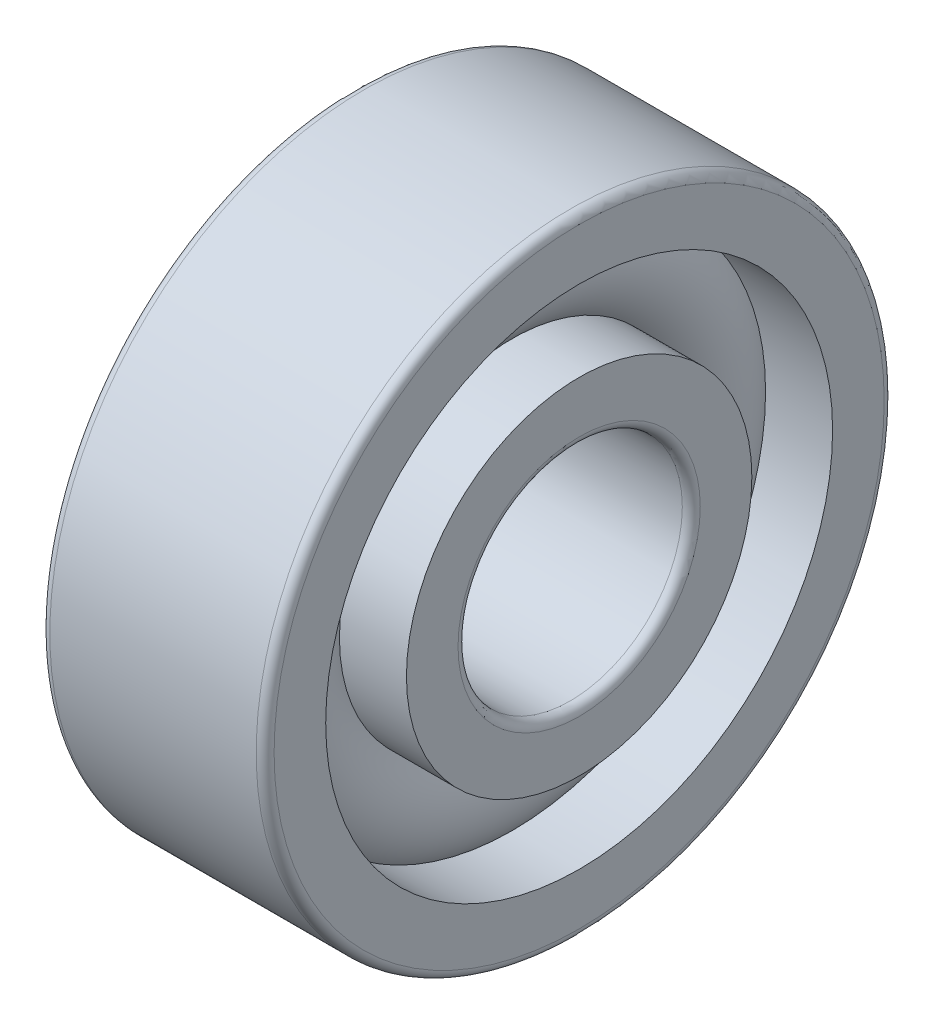
ISO-10303-21;
HEADER;
FILE_DESCRIPTION(('STEP AP214'),'2;1');
FILE_NAME('part.step','',(''),(''),'','','');
FILE_SCHEMA(('AUTOMOTIVE_DESIGN { 1 0 10303 214 1 1 1 1 }'));
ENDSEC;
DATA;
#1=APPLICATION_CONTEXT('core data for automotive mechanical design processes');
#2=APPLICATION_PROTOCOL_DEFINITION('international standard','automotive_design',2000,#1);
#3=PRODUCT_CONTEXT('',#1,'mechanical');
#4=PRODUCT('Part','Part','',(#3));
#5=PRODUCT_RELATED_PRODUCT_CATEGORY('part','',(#4));
#6=PRODUCT_DEFINITION_FORMATION('','',#4);
#7=PRODUCT_DEFINITION_CONTEXT('part definition',#1,'design');
#8=PRODUCT_DEFINITION('design','',#6,#7);
#9=PRODUCT_DEFINITION_SHAPE('','',#8);
#10=(LENGTH_UNIT() NAMED_UNIT(*) SI_UNIT(.MILLI.,.METRE.));
#11=(NAMED_UNIT(*) PLANE_ANGLE_UNIT() SI_UNIT($,.RADIAN.));
#12=(NAMED_UNIT(*) SI_UNIT($,.STERADIAN.) SOLID_ANGLE_UNIT());
#13=UNCERTAINTY_MEASURE_WITH_UNIT(LENGTH_MEASURE(1.E-05),#10,'distance_accuracy_value','');
#14=(GEOMETRIC_REPRESENTATION_CONTEXT(3) GLOBAL_UNCERTAINTY_ASSIGNED_CONTEXT((#13)) GLOBAL_UNIT_ASSIGNED_CONTEXT((#10,
#11,#12)) REPRESENTATION_CONTEXT('',''));
#15=CARTESIAN_POINT('',(0.,0.,0.));
#16=DIRECTION('',(0.,0.,1.));
#17=DIRECTION('',(1.,0.,0.));
#18=AXIS2_PLACEMENT_3D('',#15,#16,#17);
#19=CARTESIAN_POINT('',(0.,0.,0.));
#20=DIRECTION('',(-1.,0.,0.));
#21=DIRECTION('',(0.,0.,1.));
#22=AXIS2_PLACEMENT_3D('',#19,#20,#21);
#23=TOROIDAL_SURFACE('',#22,4.75,1.35);
#24=CARTESIAN_POINT('',(1.0062305898749,0.,0.));
#25=DIRECTION('',(-1.,0.,0.));
#26=DIRECTION('',(0.,0.,1.));
#27=AXIS2_PLACEMENT_3D('',#24,#25,#26);
#28=CIRCLE('',#27,5.65000000000001);
#29=CARTESIAN_POINT('',(1.0062305898749,0.,5.65000000000001));
#30=VERTEX_POINT('',#29);
#31=EDGE_CURVE('E38',#30,#30,#28,.F.);
#32=ORIENTED_EDGE('',*,*,#31,.T.);
#33=EDGE_LOOP('',(#32));
#34=FACE_BOUND('',#33,.T.);
#35=CARTESIAN_POINT('',(1.00623058987491,0.,0.));
#36=DIRECTION('',(-1.,0.,0.));
#37=DIRECTION('',(0.,0.,1.));
#38=AXIS2_PLACEMENT_3D('',#35,#36,#37);
#39=CIRCLE('',#38,3.85);
#40=CARTESIAN_POINT('',(1.00623058987491,0.,3.85));
#41=VERTEX_POINT('',#40);
#42=EDGE_CURVE('E10',#41,#41,#39,.T.);
#43=ORIENTED_EDGE('',*,*,#42,.T.);
#44=EDGE_LOOP('',(#43));
#45=FACE_BOUND('',#44,.T.);
#46=ADVANCED_FACE('F34',(#34,#45),#23,.T.);
#47=CARTESIAN_POINT('',(-20.6375,0.,0.));
#48=DIRECTION('',(1.,0.,0.));
#49=DIRECTION('',(0.,0.,-1.));
#50=AXIS2_PLACEMENT_3D('',#47,#48,#49);
#51=CYLINDRICAL_SURFACE('',#50,3.85);
#52=CARTESIAN_POINT('',(2.5,0.,0.));
#53=DIRECTION('',(1.,0.,0.));
#54=DIRECTION('',(0.,0.,-1.));
#55=AXIS2_PLACEMENT_3D('',#52,#53,#54);
#56=CIRCLE('',#55,3.85);
#57=CARTESIAN_POINT('',(2.5,0.,-3.85));
#58=VERTEX_POINT('',#57);
#59=EDGE_CURVE('E47',#58,#58,#56,.T.);
#60=ORIENTED_EDGE('',*,*,#59,.F.);
#61=EDGE_LOOP('',(#60));
#62=FACE_BOUND('',#61,.T.);
#63=ORIENTED_EDGE('',*,*,#42,.F.);
#64=EDGE_LOOP('',(#63));
#65=FACE_BOUND('',#64,.T.);
#66=ADVANCED_FACE('F86',(#62,#65),#51,.T.);
#67=CARTESIAN_POINT('',(-20.6375,0.,0.));
#68=DIRECTION('',(1.,0.,0.));
#69=DIRECTION('',(0.,0.,-1.));
#70=AXIS2_PLACEMENT_3D('',#67,#68,#69);
#71=CYLINDRICAL_SURFACE('',#70,3.85);
#72=CARTESIAN_POINT('',(-2.5,0.,0.));
#73=DIRECTION('',(1.,0.,0.));
#74=DIRECTION('',(0.,0.,-1.));
#75=AXIS2_PLACEMENT_3D('',#72,#73,#74);
#76=CIRCLE('',#75,3.85);
#77=CARTESIAN_POINT('',(-2.5,0.,-3.85));
#78=VERTEX_POINT('',#77);
#79=EDGE_CURVE('E56',#78,#78,#76,.T.);
#80=ORIENTED_EDGE('',*,*,#79,.T.);
#81=EDGE_LOOP('',(#80));
#82=FACE_BOUND('',#81,.T.);
#83=CARTESIAN_POINT('',(-1.00623058987491,0.,0.));
#84=DIRECTION('',(1.,0.,0.));
#85=DIRECTION('',(0.,0.,-1.));
#86=AXIS2_PLACEMENT_3D('',#83,#84,#85);
#87=CIRCLE('',#86,3.85);
#88=CARTESIAN_POINT('',(-1.00623058987491,0.,-3.85));
#89=VERTEX_POINT('',#88);
#90=EDGE_CURVE('E42',#89,#89,#87,.T.);
#91=ORIENTED_EDGE('',*,*,#90,.F.);
#92=EDGE_LOOP('',(#91));
#93=FACE_BOUND('',#92,.T.);
#94=ADVANCED_FACE('F89',(#82,#93),#71,.T.);
#95=CARTESIAN_POINT('',(2.5,2.7,0.));
#96=DIRECTION('',(1.,0.,0.));
#97=DIRECTION('',(0.,0.,-1.));
#98=AXIS2_PLACEMENT_3D('',#95,#96,#97);
#99=PLANE('',#98);
#100=ORIENTED_EDGE('',*,*,#59,.T.);
#101=EDGE_LOOP('',(#100));
#102=FACE_BOUND('',#101,.T.);
#103=CARTESIAN_POINT('',(2.5,0.,0.));
#104=DIRECTION('',(1.,0.,0.));
#105=DIRECTION('',(0.,0.,-1.));
#106=AXIS2_PLACEMENT_3D('',#103,#104,#105);
#107=CIRCLE('',#106,2.7);
#108=CARTESIAN_POINT('',(2.5,0.,-2.7));
#109=VERTEX_POINT('',#108);
#110=EDGE_CURVE('E78',#109,#109,#107,.T.);
#111=ORIENTED_EDGE('',*,*,#110,.F.);
#112=EDGE_LOOP('',(#111));
#113=FACE_BOUND('',#112,.T.);
#114=ADVANCED_FACE('F83',(#102,#113),#99,.T.);
#115=CARTESIAN_POINT('',(2.3,0.,0.));
#116=DIRECTION('',(1.,0.,0.));
#117=DIRECTION('',(0.,0.,-1.));
#118=AXIS2_PLACEMENT_3D('',#115,#116,#117);
#119=TOROIDAL_SURFACE('',#118,2.7,0.199999999999999);
#120=ORIENTED_EDGE('',*,*,#110,.T.);
#121=EDGE_LOOP('',(#120));
#122=FACE_BOUND('',#121,.T.);
#123=CARTESIAN_POINT('',(2.3,0.,0.));
#124=DIRECTION('',(1.,0.,0.));
#125=DIRECTION('',(0.,0.,-1.));
#126=AXIS2_PLACEMENT_3D('',#123,#124,#125);
#127=CIRCLE('',#126,2.5);
#128=CARTESIAN_POINT('',(2.3,0.,-2.5));
#129=VERTEX_POINT('',#128);
#130=EDGE_CURVE('E75',#129,#129,#127,.T.);
#131=ORIENTED_EDGE('',*,*,#130,.F.);
#132=EDGE_LOOP('',(#131));
#133=FACE_BOUND('',#132,.T.);
#134=ADVANCED_FACE('F100',(#122,#133),#119,.T.);
#135=CARTESIAN_POINT('',(-20.6375,0.,0.));
#136=DIRECTION('',(1.,0.,0.));
#137=DIRECTION('',(0.,0.,-1.));
#138=AXIS2_PLACEMENT_3D('',#135,#136,#137);
#139=CYLINDRICAL_SURFACE('',#138,2.5);
#140=ORIENTED_EDGE('',*,*,#130,.T.);
#141=EDGE_LOOP('',(#140));
#142=FACE_BOUND('',#141,.T.);
#143=CARTESIAN_POINT('',(-2.3,0.,0.));
#144=DIRECTION('',(1.,0.,0.));
#145=DIRECTION('',(0.,0.,-1.));
#146=AXIS2_PLACEMENT_3D('',#143,#144,#145);
#147=CIRCLE('',#146,2.5);
#148=CARTESIAN_POINT('',(-2.3,0.,-2.5));
#149=VERTEX_POINT('',#148);
#150=EDGE_CURVE('E72',#149,#149,#147,.T.);
#151=ORIENTED_EDGE('',*,*,#150,.F.);
#152=EDGE_LOOP('',(#151));
#153=FACE_BOUND('',#152,.T.);
#154=ADVANCED_FACE('F103',(#142,#153),#139,.F.);
#155=CARTESIAN_POINT('',(-2.3,0.,0.));
#156=DIRECTION('',(1.,0.,0.));
#157=DIRECTION('',(0.,0.,-1.));
#158=AXIS2_PLACEMENT_3D('',#155,#156,#157);
#159=TOROIDAL_SURFACE('',#158,2.7,0.199999999999999);
#160=ORIENTED_EDGE('',*,*,#150,.T.);
#161=EDGE_LOOP('',(#160));
#162=FACE_BOUND('',#161,.T.);
#163=CARTESIAN_POINT('',(-2.5,0.,0.));
#164=DIRECTION('',(1.,0.,0.));
#165=DIRECTION('',(0.,0.,-1.));
#166=AXIS2_PLACEMENT_3D('',#163,#164,#165);
#167=CIRCLE('',#166,2.7);
#168=CARTESIAN_POINT('',(-2.5,0.,-2.7));
#169=VERTEX_POINT('',#168);
#170=EDGE_CURVE('E69',#169,#169,#167,.T.);
#171=ORIENTED_EDGE('',*,*,#170,.F.);
#172=EDGE_LOOP('',(#171));
#173=FACE_BOUND('',#172,.T.);
#174=ADVANCED_FACE('F107',(#162,#173),#159,.T.);
#175=CARTESIAN_POINT('',(-2.5,3.85,0.));
#176=DIRECTION('',(-1.,0.,0.));
#177=DIRECTION('',(0.,0.,1.));
#178=AXIS2_PLACEMENT_3D('',#175,#176,#177);
#179=PLANE('',#178);
#180=ORIENTED_EDGE('',*,*,#170,.T.);
#181=EDGE_LOOP('',(#180));
#182=FACE_BOUND('',#181,.T.);
#183=ORIENTED_EDGE('',*,*,#79,.F.);
#184=EDGE_LOOP('',(#183));
#185=FACE_BOUND('',#184,.T.);
#186=ADVANCED_FACE('F111',(#182,#185),#179,.T.);
#187=CARTESIAN_POINT('',(-1.0062305898749,0.,0.));
#188=DIRECTION('',(1.,0.,0.));
#189=DIRECTION('',(0.,0.,-1.));
#190=AXIS2_PLACEMENT_3D('',#187,#188,#189);
#191=CIRCLE('',#190,5.65000000000001);
#192=CARTESIAN_POINT('',(-1.0062305898749,0.,-5.65000000000001));
#193=VERTEX_POINT('',#192);
#194=EDGE_CURVE('E50',#193,#193,#191,.F.);
#195=ORIENTED_EDGE('',*,*,#194,.T.);
#196=EDGE_LOOP('',(#195));
#197=FACE_BOUND('',#196,.T.);
#198=ORIENTED_EDGE('',*,*,#90,.T.);
#199=EDGE_LOOP('',(#198));
#200=FACE_BOUND('',#199,.T.);
#201=ADVANCED_FACE('F36',(#197,#200),#23,.T.);
#202=CARTESIAN_POINT('',(-20.6375,0.,0.));
#203=DIRECTION('',(1.,0.,0.));
#204=DIRECTION('',(0.,0.,-1.));
#205=AXIS2_PLACEMENT_3D('',#202,#203,#204);
#206=CYLINDRICAL_SURFACE('',#205,5.65000000000001);
#207=CARTESIAN_POINT('',(2.5,0.,0.));
#208=DIRECTION('',(1.,0.,0.));
#209=DIRECTION('',(0.,0.,-1.));
#210=AXIS2_PLACEMENT_3D('',#207,#208,#209);
#211=CIRCLE('',#210,5.65000000000001);
#212=CARTESIAN_POINT('',(2.5,0.,-5.65000000000001));
#213=VERTEX_POINT('',#212);
#214=EDGE_CURVE('E52',#213,#213,#211,.T.);
#215=ORIENTED_EDGE('',*,*,#214,.T.);
#216=EDGE_LOOP('',(#215));
#217=FACE_BOUND('',#216,.T.);
#218=ORIENTED_EDGE('',*,*,#31,.F.);
#219=EDGE_LOOP('',(#218));
#220=FACE_BOUND('',#219,.T.);
#221=ADVANCED_FACE('F116',(#217,#220),#206,.F.);
#222=CARTESIAN_POINT('',(-20.6375,0.,0.));
#223=DIRECTION('',(1.,0.,0.));
#224=DIRECTION('',(0.,0.,-1.));
#225=AXIS2_PLACEMENT_3D('',#222,#223,#224);
#226=CYLINDRICAL_SURFACE('',#225,5.65000000000001);
#227=CARTESIAN_POINT('',(-2.5,0.,0.));
#228=DIRECTION('',(1.,0.,0.));
#229=DIRECTION('',(0.,0.,-1.));
#230=AXIS2_PLACEMENT_3D('',#227,#228,#229);
#231=CIRCLE('',#230,5.65000000000001);
#232=CARTESIAN_POINT('',(-2.5,0.,-5.65000000000001));
#233=VERTEX_POINT('',#232);
#234=EDGE_CURVE('E147',#233,#233,#231,.T.);
#235=ORIENTED_EDGE('',*,*,#234,.F.);
#236=EDGE_LOOP('',(#235));
#237=FACE_BOUND('',#236,.T.);
#238=ORIENTED_EDGE('',*,*,#194,.F.);
#239=EDGE_LOOP('',(#238));
#240=FACE_BOUND('',#239,.T.);
#241=ADVANCED_FACE('F119',(#237,#240),#226,.F.);
#242=CARTESIAN_POINT('',(2.5,6.80000000000001,0.));
#243=DIRECTION('',(1.,0.,0.));
#244=DIRECTION('',(0.,0.,-1.));
#245=AXIS2_PLACEMENT_3D('',#242,#243,#244);
#246=PLANE('',#245);
#247=CARTESIAN_POINT('',(2.5,0.,0.));
#248=DIRECTION('',(1.,0.,0.));
#249=DIRECTION('',(0.,0.,-1.));
#250=AXIS2_PLACEMENT_3D('',#247,#248,#249);
#251=CIRCLE('',#250,6.80000000000001);
#252=CARTESIAN_POINT('',(2.5,0.,-6.80000000000001));
#253=VERTEX_POINT('',#252);
#254=EDGE_CURVE('E58',#253,#253,#251,.T.);
#255=ORIENTED_EDGE('',*,*,#254,.T.);
#256=EDGE_LOOP('',(#255));
#257=FACE_BOUND('',#256,.T.);
#258=ORIENTED_EDGE('',*,*,#214,.F.);
#259=EDGE_LOOP('',(#258));
#260=FACE_BOUND('',#259,.T.);
#261=ADVANCED_FACE('F120',(#257,#260),#246,.T.);
#262=CARTESIAN_POINT('',(2.3,0.,0.));
#263=DIRECTION('',(1.,0.,0.));
#264=DIRECTION('',(0.,0.,-1.));
#265=AXIS2_PLACEMENT_3D('',#262,#263,#264);
#266=TOROIDAL_SURFACE('',#265,6.80000000000001,0.2);
#267=CARTESIAN_POINT('',(2.3,0.,0.));
#268=DIRECTION('',(1.,0.,0.));
#269=DIRECTION('',(0.,0.,-1.));
#270=AXIS2_PLACEMENT_3D('',#267,#268,#269);
#271=CIRCLE('',#270,7.00000000000001);
#272=CARTESIAN_POINT('',(2.3,0.,-7.00000000000001));
#273=VERTEX_POINT('',#272);
#274=EDGE_CURVE('E63',#273,#273,#271,.T.);
#275=ORIENTED_EDGE('',*,*,#274,.T.);
#276=EDGE_LOOP('',(#275));
#277=FACE_BOUND('',#276,.T.);
#278=ORIENTED_EDGE('',*,*,#254,.F.);
#279=EDGE_LOOP('',(#278));
#280=FACE_BOUND('',#279,.T.);
#281=ADVANCED_FACE('F123',(#277,#280),#266,.T.);
#282=CARTESIAN_POINT('',(-20.6375,0.,0.));
#283=DIRECTION('',(1.,0.,0.));
#284=DIRECTION('',(0.,0.,-1.));
#285=AXIS2_PLACEMENT_3D('',#282,#283,#284);
#286=CYLINDRICAL_SURFACE('',#285,7.00000000000001);
#287=CARTESIAN_POINT('',(-2.3,0.,0.));
#288=DIRECTION('',(1.,0.,0.));
#289=DIRECTION('',(0.,0.,-1.));
#290=AXIS2_PLACEMENT_3D('',#287,#288,#289);
#291=CIRCLE('',#290,7.00000000000001);
#292=CARTESIAN_POINT('',(-2.3,0.,-7.00000000000001));
#293=VERTEX_POINT('',#292);
#294=EDGE_CURVE('E151',#293,#293,#291,.T.);
#295=ORIENTED_EDGE('',*,*,#294,.T.);
#296=EDGE_LOOP('',(#295));
#297=FACE_BOUND('',#296,.T.);
#298=ORIENTED_EDGE('',*,*,#274,.F.);
#299=EDGE_LOOP('',(#298));
#300=FACE_BOUND('',#299,.T.);
#301=ADVANCED_FACE('F127',(#297,#300),#286,.T.);
#302=CARTESIAN_POINT('',(-2.3,0.,0.));
#303=DIRECTION('',(1.,0.,0.));
#304=DIRECTION('',(0.,0.,-1.));
#305=AXIS2_PLACEMENT_3D('',#302,#303,#304);
#306=TOROIDAL_SURFACE('',#305,6.80000000000001,0.2);
#307=CARTESIAN_POINT('',(-2.5,0.,0.));
#308=DIRECTION('',(1.,0.,0.));
#309=DIRECTION('',(0.,0.,-1.));
#310=AXIS2_PLACEMENT_3D('',#307,#308,#309);
#311=CIRCLE('',#310,6.80000000000001);
#312=CARTESIAN_POINT('',(-2.5,0.,-6.80000000000001));
#313=VERTEX_POINT('',#312);
#314=EDGE_CURVE('E148',#313,#313,#311,.T.);
#315=ORIENTED_EDGE('',*,*,#314,.T.);
#316=EDGE_LOOP('',(#315));
#317=FACE_BOUND('',#316,.T.);
#318=ORIENTED_EDGE('',*,*,#294,.F.);
#319=EDGE_LOOP('',(#318));
#320=FACE_BOUND('',#319,.T.);
#321=ADVANCED_FACE('F131',(#317,#320),#306,.T.);
#322=CARTESIAN_POINT('',(-2.5,5.65000000000001,0.));
#323=DIRECTION('',(-1.,0.,0.));
#324=DIRECTION('',(0.,0.,1.));
#325=AXIS2_PLACEMENT_3D('',#322,#323,#324);
#326=PLANE('',#325);
#327=ORIENTED_EDGE('',*,*,#234,.T.);
#328=EDGE_LOOP('',(#327));
#329=FACE_BOUND('',#328,.T.);
#330=ORIENTED_EDGE('',*,*,#314,.F.);
#331=EDGE_LOOP('',(#330));
#332=FACE_BOUND('',#331,.T.);
#333=ADVANCED_FACE('F135',(#329,#332),#326,.T.);
#334=CLOSED_SHELL('',(#46,#66,#94,#114,#134,#154,#174,#186,#201,#221,#241,#261,#281,#301,#321,#333));
#335=MANIFOLD_SOLID_BREP('B2',#334);
#336=ADVANCED_BREP_SHAPE_REPRESENTATION('',(#18,#335),#14);
#337=SHAPE_DEFINITION_REPRESENTATION(#9,#336);
ENDSEC;
END-ISO-10303-21;
